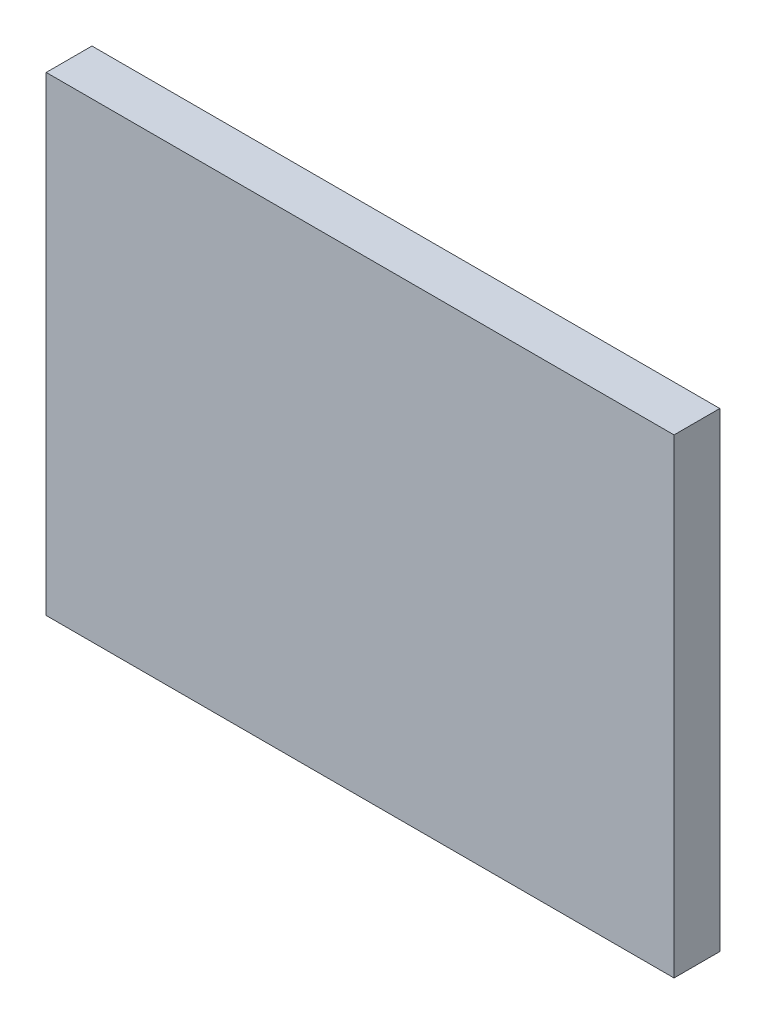
ISO-10303-21;
HEADER;
FILE_DESCRIPTION(('STEP AP214'),'2;1');
FILE_NAME('part.step','',(''),(''),'','','');
FILE_SCHEMA(('AUTOMOTIVE_DESIGN { 1 0 10303 214 1 1 1 1 }'));
ENDSEC;
DATA;
#1=APPLICATION_CONTEXT('core data for automotive mechanical design processes');
#2=APPLICATION_PROTOCOL_DEFINITION('international standard','automotive_design',2000,#1);
#3=PRODUCT_CONTEXT('',#1,'mechanical');
#4=PRODUCT('Part','Part','',(#3));
#5=PRODUCT_RELATED_PRODUCT_CATEGORY('part','',(#4));
#6=PRODUCT_DEFINITION_FORMATION('','',#4);
#7=PRODUCT_DEFINITION_CONTEXT('part definition',#1,'design');
#8=PRODUCT_DEFINITION('design','',#6,#7);
#9=PRODUCT_DEFINITION_SHAPE('','',#8);
#10=(LENGTH_UNIT() NAMED_UNIT(*) SI_UNIT(.MILLI.,.METRE.));
#11=(NAMED_UNIT(*) PLANE_ANGLE_UNIT() SI_UNIT($,.RADIAN.));
#12=(NAMED_UNIT(*) SI_UNIT($,.STERADIAN.) SOLID_ANGLE_UNIT());
#13=UNCERTAINTY_MEASURE_WITH_UNIT(LENGTH_MEASURE(1.E-05),#10,'distance_accuracy_value','');
#14=(GEOMETRIC_REPRESENTATION_CONTEXT(3) GLOBAL_UNCERTAINTY_ASSIGNED_CONTEXT((#13)) GLOBAL_UNIT_ASSIGNED_CONTEXT((#10,
#11,#12)) REPRESENTATION_CONTEXT('',''));
#15=CARTESIAN_POINT('',(0.,0.,0.));
#16=DIRECTION('',(0.,0.,1.));
#17=DIRECTION('',(1.,0.,0.));
#18=AXIS2_PLACEMENT_3D('',#15,#16,#17);
#19=CARTESIAN_POINT('',(29.49999942,22.09999898,4.30010062));
#20=DIRECTION('',(0.,0.,-1.));
#21=DIRECTION('',(-1.,0.,0.));
#22=AXIS2_PLACEMENT_3D('',#19,#20,#21);
#23=PLANE('',#22);
#24=DIRECTION('',(0.,1.,0.));
#25=VECTOR('',#24,1.);
#26=CARTESIAN_POINT('',(-29.49999942,22.09999898,4.30010062));
#27=LINE('',#26,#25);
#28=CARTESIAN_POINT('',(-29.49999942,22.09999898,4.30010062));
#29=VERTEX_POINT('',#28);
#30=CARTESIAN_POINT('',(-29.49999942,-22.09999898,4.30010062));
#31=VERTEX_POINT('',#30);
#32=EDGE_CURVE('E55',#29,#31,#27,.F.);
#33=ORIENTED_EDGE('',*,*,#32,.T.);
#34=DIRECTION('',(1.,0.,0.));
#35=VECTOR('',#34,1.);
#36=CARTESIAN_POINT('',(-29.49999942,-22.09999898,4.30010062));
#37=LINE('',#36,#35);
#38=CARTESIAN_POINT('',(29.49999942,-22.09999898,4.30010062));
#39=VERTEX_POINT('',#38);
#40=EDGE_CURVE('E57',#31,#39,#37,.T.);
#41=ORIENTED_EDGE('',*,*,#40,.T.);
#42=DIRECTION('',(0.,1.,0.));
#43=VECTOR('',#42,1.);
#44=CARTESIAN_POINT('',(29.49999942,-22.09999898,4.30010062));
#45=LINE('',#44,#43);
#46=CARTESIAN_POINT('',(29.49999942,22.09999898,4.30010062));
#47=VERTEX_POINT('',#46);
#48=EDGE_CURVE('E20',#39,#47,#45,.T.);
#49=ORIENTED_EDGE('',*,*,#48,.T.);
#50=DIRECTION('',(1.,0.,0.));
#51=VECTOR('',#50,1.);
#52=CARTESIAN_POINT('',(29.49999942,22.09999898,4.30010062));
#53=LINE('',#52,#51);
#54=EDGE_CURVE('E80',#47,#29,#53,.F.);
#55=ORIENTED_EDGE('',*,*,#54,.T.);
#56=EDGE_LOOP('',(#33,#41,#49,#55));
#57=FACE_BOUND('',#56,.T.);
#58=ADVANCED_FACE('F17',(#57),#23,.F.);
#59=CARTESIAN_POINT('',(29.49999942,-22.09999898,0.));
#60=DIRECTION('',(-1.,0.,0.));
#61=DIRECTION('',(0.,0.,1.));
#62=AXIS2_PLACEMENT_3D('',#59,#60,#61);
#63=PLANE('',#62);
#64=DIRECTION('',(0.,0.,-1.));
#65=VECTOR('',#64,1.);
#66=CARTESIAN_POINT('',(29.49999942,22.09999898,0.));
#67=LINE('',#66,#65);
#68=CARTESIAN_POINT('',(29.49999942,22.09999898,0.));
#69=VERTEX_POINT('',#68);
#70=EDGE_CURVE('E68',#69,#47,#67,.F.);
#71=ORIENTED_EDGE('',*,*,#70,.T.);
#72=ORIENTED_EDGE('',*,*,#48,.F.);
#73=DIRECTION('',(0.,0.,1.));
#74=VECTOR('',#73,1.);
#75=CARTESIAN_POINT('',(29.49999942,-22.09999898,0.));
#76=LINE('',#75,#74);
#77=CARTESIAN_POINT('',(29.49999942,-22.09999898,0.));
#78=VERTEX_POINT('',#77);
#79=EDGE_CURVE('E63',#39,#78,#76,.F.);
#80=ORIENTED_EDGE('',*,*,#79,.T.);
#81=DIRECTION('',(0.,1.,0.));
#82=VECTOR('',#81,1.);
#83=CARTESIAN_POINT('',(29.49999942,22.09999898,0.));
#84=LINE('',#83,#82);
#85=EDGE_CURVE('E83',#69,#78,#84,.F.);
#86=ORIENTED_EDGE('',*,*,#85,.F.);
#87=EDGE_LOOP('',(#71,#72,#80,#86));
#88=FACE_BOUND('',#87,.T.);
#89=ADVANCED_FACE('F65',(#88),#63,.F.);
#90=CARTESIAN_POINT('',(-29.49999942,-22.09999898,0.));
#91=DIRECTION('',(0.,1.,0.));
#92=DIRECTION('',(0.,0.,1.));
#93=AXIS2_PLACEMENT_3D('',#90,#91,#92);
#94=PLANE('',#93);
#95=ORIENTED_EDGE('',*,*,#79,.F.);
#96=ORIENTED_EDGE('',*,*,#40,.F.);
#97=DIRECTION('',(0.,0.,-1.));
#98=VECTOR('',#97,1.);
#99=CARTESIAN_POINT('',(-29.49999942,-22.09999898,0.));
#100=LINE('',#99,#98);
#101=CARTESIAN_POINT('',(-29.49999942,-22.09999898,0.));
#102=VERTEX_POINT('',#101);
#103=EDGE_CURVE('E75',#31,#102,#100,.T.);
#104=ORIENTED_EDGE('',*,*,#103,.T.);
#105=DIRECTION('',(-1.,0.,0.));
#106=VECTOR('',#105,1.);
#107=CARTESIAN_POINT('',(29.49999942,-22.09999898,0.));
#108=LINE('',#107,#106);
#109=EDGE_CURVE('E72',#78,#102,#108,.T.);
#110=ORIENTED_EDGE('',*,*,#109,.F.);
#111=EDGE_LOOP('',(#95,#96,#104,#110));
#112=FACE_BOUND('',#111,.T.);
#113=ADVANCED_FACE('F70',(#112),#94,.F.);
#114=CARTESIAN_POINT('',(-29.49999942,22.09999898,0.));
#115=DIRECTION('',(1.,0.,0.));
#116=DIRECTION('',(0.,0.,-1.));
#117=AXIS2_PLACEMENT_3D('',#114,#115,#116);
#118=PLANE('',#117);
#119=ORIENTED_EDGE('',*,*,#103,.F.);
#120=ORIENTED_EDGE('',*,*,#32,.F.);
#121=DIRECTION('',(0.,0.,-1.));
#122=VECTOR('',#121,1.);
#123=CARTESIAN_POINT('',(-29.49999942,22.09999898,0.));
#124=LINE('',#123,#122);
#125=CARTESIAN_POINT('',(-29.49999942,22.09999898,0.));
#126=VERTEX_POINT('',#125);
#127=EDGE_CURVE('E35',#29,#126,#124,.T.);
#128=ORIENTED_EDGE('',*,*,#127,.T.);
#129=DIRECTION('',(0.,1.,0.));
#130=VECTOR('',#129,1.);
#131=CARTESIAN_POINT('',(-29.49999942,22.09999898,0.));
#132=LINE('',#131,#130);
#133=EDGE_CURVE('E26',#102,#126,#132,.T.);
#134=ORIENTED_EDGE('',*,*,#133,.F.);
#135=EDGE_LOOP('',(#119,#120,#128,#134));
#136=FACE_BOUND('',#135,.T.);
#137=ADVANCED_FACE('F89',(#136),#118,.F.);
#138=CARTESIAN_POINT('',(29.49999942,22.09999898,0.));
#139=DIRECTION('',(0.,-1.,0.));
#140=DIRECTION('',(0.,0.,-1.));
#141=AXIS2_PLACEMENT_3D('',#138,#139,#140);
#142=PLANE('',#141);
#143=ORIENTED_EDGE('',*,*,#127,.F.);
#144=ORIENTED_EDGE('',*,*,#54,.F.);
#145=ORIENTED_EDGE('',*,*,#70,.F.);
#146=DIRECTION('',(-1.,0.,0.));
#147=VECTOR('',#146,1.);
#148=CARTESIAN_POINT('',(29.49999942,22.09999898,0.));
#149=LINE('',#148,#147);
#150=EDGE_CURVE('E11',#126,#69,#149,.F.);
#151=ORIENTED_EDGE('',*,*,#150,.F.);
#152=EDGE_LOOP('',(#143,#144,#145,#151));
#153=FACE_BOUND('',#152,.T.);
#154=ADVANCED_FACE('F91',(#153),#142,.F.);
#155=CARTESIAN_POINT('',(29.49999942,22.09999898,0.));
#156=DIRECTION('',(0.,0.,-1.));
#157=DIRECTION('',(-1.,0.,0.));
#158=AXIS2_PLACEMENT_3D('',#155,#156,#157);
#159=PLANE('',#158);
#160=ORIENTED_EDGE('',*,*,#133,.T.);
#161=ORIENTED_EDGE('',*,*,#150,.T.);
#162=ORIENTED_EDGE('',*,*,#85,.T.);
#163=ORIENTED_EDGE('',*,*,#109,.T.);
#164=EDGE_LOOP('',(#160,#161,#162,#163));
#165=FACE_BOUND('',#164,.T.);
#166=ADVANCED_FACE('F88',(#165),#159,.T.);
#167=CLOSED_SHELL('',(#58,#89,#113,#137,#154,#166));
#168=MANIFOLD_SOLID_BREP('B1',#167);
#169=ADVANCED_BREP_SHAPE_REPRESENTATION('',(#18,#168),#14);
#170=SHAPE_DEFINITION_REPRESENTATION(#9,#169);
ENDSEC;
END-ISO-10303-21;
